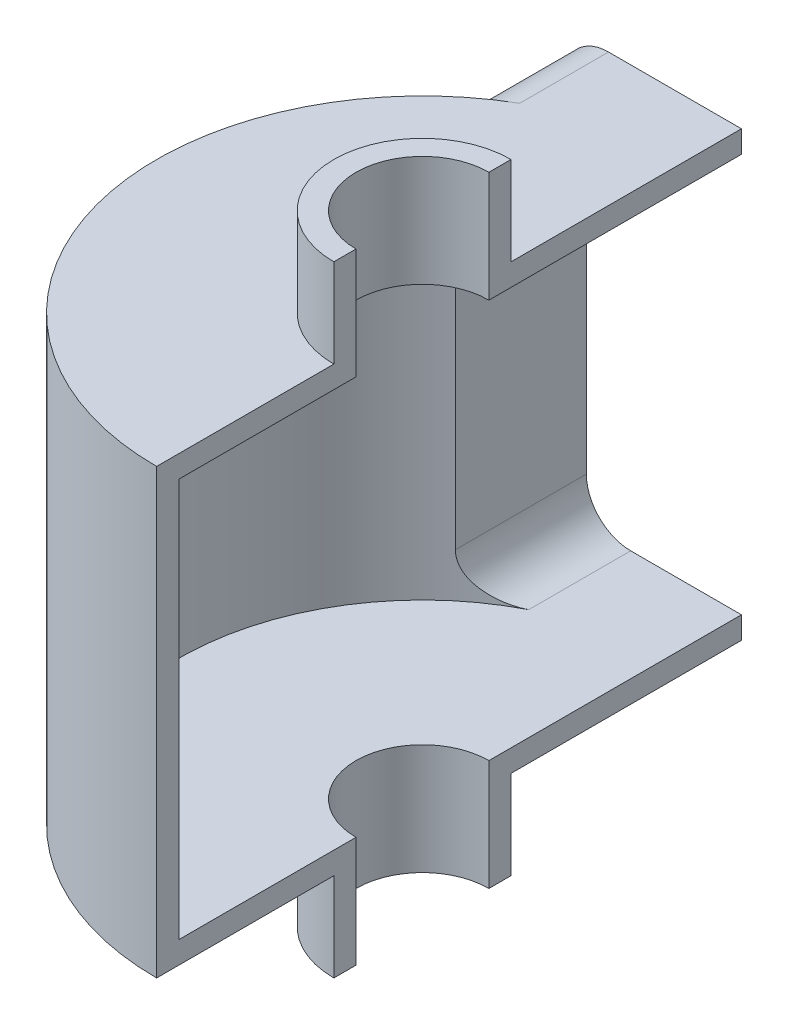
ISO-10303-21;
HEADER;
FILE_DESCRIPTION(('STEP AP214'),'2;1');
FILE_NAME('part.step','',(''),(''),'','','');
FILE_SCHEMA(('AUTOMOTIVE_DESIGN { 1 0 10303 214 1 1 1 1 }'));
ENDSEC;
DATA;
#1=APPLICATION_CONTEXT('core data for automotive mechanical design processes');
#2=APPLICATION_PROTOCOL_DEFINITION('international standard','automotive_design',2000,#1);
#3=PRODUCT_CONTEXT('',#1,'mechanical');
#4=PRODUCT('Part','Part','',(#3));
#5=PRODUCT_RELATED_PRODUCT_CATEGORY('part','',(#4));
#6=PRODUCT_DEFINITION_FORMATION('','',#4);
#7=PRODUCT_DEFINITION_CONTEXT('part definition',#1,'design');
#8=PRODUCT_DEFINITION('design','',#6,#7);
#9=PRODUCT_DEFINITION_SHAPE('','',#8);
#10=(LENGTH_UNIT() NAMED_UNIT(*) SI_UNIT(.MILLI.,.METRE.));
#11=(NAMED_UNIT(*) PLANE_ANGLE_UNIT() SI_UNIT($,.RADIAN.));
#12=(NAMED_UNIT(*) SI_UNIT($,.STERADIAN.) SOLID_ANGLE_UNIT());
#13=UNCERTAINTY_MEASURE_WITH_UNIT(LENGTH_MEASURE(1.E-05),#10,'distance_accuracy_value','');
#14=(GEOMETRIC_REPRESENTATION_CONTEXT(3) GLOBAL_UNCERTAINTY_ASSIGNED_CONTEXT((#13)) GLOBAL_UNIT_ASSIGNED_CONTEXT((#10,
#11,#12)) REPRESENTATION_CONTEXT('',''));
#15=CARTESIAN_POINT('',(0.,0.,0.));
#16=DIRECTION('',(0.,0.,1.));
#17=DIRECTION('',(1.,0.,0.));
#18=AXIS2_PLACEMENT_3D('',#15,#16,#17);
#19=CARTESIAN_POINT('',(0.,25.,0.));
#20=DIRECTION('',(0.,-1.,0.));
#21=DIRECTION('',(0.,0.,-1.));
#22=AXIS2_PLACEMENT_3D('',#19,#20,#21);
#23=CYLINDRICAL_SURFACE('',#22,15.);
#24=CARTESIAN_POINT('',(0.,0.,0.));
#25=DIRECTION('',(0.,-1.,0.));
#26=DIRECTION('',(0.,0.,-1.));
#27=AXIS2_PLACEMENT_3D('',#24,#25,#26);
#28=CIRCLE('',#27,15.);
#29=CARTESIAN_POINT('',(0.,0.,15.));
#30=VERTEX_POINT('',#29);
#31=CARTESIAN_POINT('',(0.,0.,-15.));
#32=VERTEX_POINT('',#31);
#33=EDGE_CURVE('E275',#30,#32,#28,.T.);
#34=ORIENTED_EDGE('',*,*,#33,.T.);
#35=DIRECTION('',(0.,-1.,0.));
#36=VECTOR('',#35,1.);
#37=CARTESIAN_POINT('',(0.,25.,-15.));
#38=LINE('',#37,#36);
#39=CARTESIAN_POINT('',(0.,25.,-15.));
#40=VERTEX_POINT('',#39);
#41=EDGE_CURVE('E299',#40,#32,#38,.T.);
#42=ORIENTED_EDGE('',*,*,#41,.F.);
#43=CARTESIAN_POINT('',(0.,25.,0.));
#44=DIRECTION('',(0.,-1.,0.));
#45=DIRECTION('',(0.,0.,-1.));
#46=AXIS2_PLACEMENT_3D('',#43,#44,#45);
#47=CIRCLE('',#46,15.);
#48=CARTESIAN_POINT('',(0.,25.,15.));
#49=VERTEX_POINT('',#48);
#50=EDGE_CURVE('E276',#49,#40,#47,.T.);
#51=ORIENTED_EDGE('',*,*,#50,.F.);
#52=DIRECTION('',(0.,-1.,0.));
#53=VECTOR('',#52,1.);
#54=CARTESIAN_POINT('',(0.,25.,15.));
#55=LINE('',#54,#53);
#56=EDGE_CURVE('E286',#49,#30,#55,.T.);
#57=ORIENTED_EDGE('',*,*,#56,.T.);
#58=EDGE_LOOP('',(#34,#42,#51,#57));
#59=FACE_BOUND('',#58,.T.);
#60=ADVANCED_FACE('F37',(#59),#23,.F.);
#61=CARTESIAN_POINT('',(0.,25.,-20.));
#62=DIRECTION('',(-1.,0.,0.));
#63=DIRECTION('',(0.,0.,1.));
#64=AXIS2_PLACEMENT_3D('',#61,#62,#63);
#65=PLANE('',#64);
#66=DIRECTION('',(0.,0.,-1.));
#67=VECTOR('',#66,1.);
#68=CARTESIAN_POINT('',(0.,0.,-20.));
#69=LINE('',#68,#67);
#70=CARTESIAN_POINT('',(0.,0.,-72.));
#71=VERTEX_POINT('',#70);
#72=EDGE_CURVE('E289',#32,#71,#69,.T.);
#73=ORIENTED_EDGE('',*,*,#72,.T.);
#74=DIRECTION('',(0.,-1.,0.));
#75=VECTOR('',#74,1.);
#76=CARTESIAN_POINT('',(0.,4.99999999999999,-72.));
#77=LINE('',#76,#75);
#78=CARTESIAN_POINT('',(0.,4.99999999999999,-72.));
#79=VERTEX_POINT('',#78);
#80=EDGE_CURVE('E272',#79,#71,#77,.T.);
#81=ORIENTED_EDGE('',*,*,#80,.F.);
#82=DIRECTION('',(0.,0.,-1.));
#83=VECTOR('',#82,1.);
#84=CARTESIAN_POINT('',(0.,4.99999999999999,-20.));
#85=LINE('',#84,#83);
#86=CARTESIAN_POINT('',(0.,5.,-20.));
#87=VERTEX_POINT('',#86);
#88=EDGE_CURVE('E252',#87,#79,#85,.T.);
#89=ORIENTED_EDGE('',*,*,#88,.F.);
#90=DIRECTION('',(0.,-1.,0.));
#91=VECTOR('',#90,1.);
#92=CARTESIAN_POINT('',(0.,25.,-20.));
#93=LINE('',#92,#91);
#94=CARTESIAN_POINT('',(0.,25.,-20.));
#95=VERTEX_POINT('',#94);
#96=EDGE_CURVE('E297',#95,#87,#93,.T.);
#97=ORIENTED_EDGE('',*,*,#96,.F.);
#98=DIRECTION('',(0.,0.,-1.));
#99=VECTOR('',#98,1.);
#100=CARTESIAN_POINT('',(0.,25.,-20.));
#101=LINE('',#100,#99);
#102=EDGE_CURVE('E279',#40,#95,#101,.T.);
#103=ORIENTED_EDGE('',*,*,#102,.F.);
#104=ORIENTED_EDGE('',*,*,#41,.T.);
#105=EDGE_LOOP('',(#73,#81,#89,#97,#103,#104));
#106=FACE_BOUND('',#105,.T.);
#107=ADVANCED_FACE('F381',(#106),#65,.F.);
#108=CARTESIAN_POINT('',(0.,25.,0.));
#109=DIRECTION('',(0.,-1.,0.));
#110=DIRECTION('',(0.,0.,-1.));
#111=AXIS2_PLACEMENT_3D('',#108,#109,#110);
#112=CYLINDRICAL_SURFACE('',#111,20.);
#113=ORIENTED_EDGE('',*,*,#96,.T.);
#114=CARTESIAN_POINT('',(0.,4.99999999999999,0.));
#115=DIRECTION('',(0.,-1.,0.));
#116=DIRECTION('',(0.,0.,1.));
#117=AXIS2_PLACEMENT_3D('',#114,#115,#116);
#118=CIRCLE('',#117,20.);
#119=CARTESIAN_POINT('',(0.,5.,20.));
#120=VERTEX_POINT('',#119);
#121=EDGE_CURVE('E249',#120,#87,#118,.T.);
#122=ORIENTED_EDGE('',*,*,#121,.F.);
#123=DIRECTION('',(0.,-1.,0.));
#124=VECTOR('',#123,1.);
#125=CARTESIAN_POINT('',(0.,25.,20.));
#126=LINE('',#125,#124);
#127=CARTESIAN_POINT('',(0.,25.,20.));
#128=VERTEX_POINT('',#127);
#129=EDGE_CURVE('E294',#128,#120,#126,.T.);
#130=ORIENTED_EDGE('',*,*,#129,.F.);
#131=CARTESIAN_POINT('',(0.,25.,0.));
#132=DIRECTION('',(0.,1.,0.));
#133=DIRECTION('',(0.,0.,-1.));
#134=AXIS2_PLACEMENT_3D('',#131,#132,#133);
#135=CIRCLE('',#134,20.);
#136=EDGE_CURVE('E282',#95,#128,#135,.T.);
#137=ORIENTED_EDGE('',*,*,#136,.F.);
#138=EDGE_LOOP('',(#113,#122,#130,#137));
#139=FACE_BOUND('',#138,.T.);
#140=ADVANCED_FACE('F386',(#139),#112,.T.);
#141=CARTESIAN_POINT('',(0.,25.,15.));
#142=DIRECTION('',(-1.,0.,0.));
#143=DIRECTION('',(0.,0.,1.));
#144=AXIS2_PLACEMENT_3D('',#141,#142,#143);
#145=PLANE('',#144);
#146=DIRECTION('',(0.,-1.,0.));
#147=VECTOR('',#146,1.);
#148=CARTESIAN_POINT('',(0.,4.99999999999999,60.));
#149=LINE('',#148,#147);
#150=CARTESIAN_POINT('',(0.,4.99999999999999,60.));
#151=VERTEX_POINT('',#150);
#152=CARTESIAN_POINT('',(0.,-95.,60.));
#153=VERTEX_POINT('',#152);
#154=EDGE_CURVE('E262',#151,#153,#149,.T.);
#155=ORIENTED_EDGE('',*,*,#154,.T.);
#156=DIRECTION('',(0.,0.,-1.));
#157=VECTOR('',#156,1.);
#158=CARTESIAN_POINT('',(0.,-95.,20.));
#159=LINE('',#158,#157);
#160=CARTESIAN_POINT('',(0.,-95.,20.));
#161=VERTEX_POINT('',#160);
#162=EDGE_CURVE('E197',#153,#161,#159,.T.);
#163=ORIENTED_EDGE('',*,*,#162,.T.);
#164=DIRECTION('',(0.,1.,0.));
#165=VECTOR('',#164,1.);
#166=CARTESIAN_POINT('',(0.,-115.,20.));
#167=LINE('',#166,#165);
#168=CARTESIAN_POINT('',(0.,-115.,20.));
#169=VERTEX_POINT('',#168);
#170=EDGE_CURVE('E230',#169,#161,#167,.T.);
#171=ORIENTED_EDGE('',*,*,#170,.F.);
#172=DIRECTION('',(0.,0.,-1.));
#173=VECTOR('',#172,1.);
#174=CARTESIAN_POINT('',(0.,-115.,15.));
#175=LINE('',#174,#173);
#176=CARTESIAN_POINT('',(0.,-115.,15.));
#177=VERTEX_POINT('',#176);
#178=EDGE_CURVE('E220',#169,#177,#175,.T.);
#179=ORIENTED_EDGE('',*,*,#178,.T.);
#180=DIRECTION('',(0.,1.,0.));
#181=VECTOR('',#180,1.);
#182=CARTESIAN_POINT('',(0.,-115.,15.));
#183=LINE('',#182,#181);
#184=CARTESIAN_POINT('',(0.,-90.,15.));
#185=VERTEX_POINT('',#184);
#186=EDGE_CURVE('E222',#177,#185,#183,.T.);
#187=ORIENTED_EDGE('',*,*,#186,.T.);
#188=DIRECTION('',(0.,0.,-1.));
#189=VECTOR('',#188,1.);
#190=CARTESIAN_POINT('',(0.,-90.,15.));
#191=LINE('',#190,#189);
#192=CARTESIAN_POINT('',(0.,-90.,55.));
#193=VERTEX_POINT('',#192);
#194=EDGE_CURVE('E215',#193,#185,#191,.T.);
#195=ORIENTED_EDGE('',*,*,#194,.F.);
#196=DIRECTION('',(0.,1.,0.));
#197=VECTOR('',#196,1.);
#198=CARTESIAN_POINT('',(0.,-115.002,55.));
#199=LINE('',#198,#197);
#200=CARTESIAN_POINT('',(0.,0.,55.));
#201=VERTEX_POINT('',#200);
#202=EDGE_CURVE('E238',#193,#201,#199,.T.);
#203=ORIENTED_EDGE('',*,*,#202,.T.);
#204=DIRECTION('',(0.,0.,-1.));
#205=VECTOR('',#204,1.);
#206=CARTESIAN_POINT('',(0.,0.,15.));
#207=LINE('',#206,#205);
#208=EDGE_CURVE('E280',#201,#30,#207,.T.);
#209=ORIENTED_EDGE('',*,*,#208,.T.);
#210=ORIENTED_EDGE('',*,*,#56,.F.);
#211=DIRECTION('',(0.,0.,-1.));
#212=VECTOR('',#211,1.);
#213=CARTESIAN_POINT('',(0.,25.,15.));
#214=LINE('',#213,#212);
#215=EDGE_CURVE('E284',#128,#49,#214,.T.);
#216=ORIENTED_EDGE('',*,*,#215,.F.);
#217=ORIENTED_EDGE('',*,*,#129,.T.);
#218=DIRECTION('',(0.,0.,-1.));
#219=VECTOR('',#218,1.);
#220=CARTESIAN_POINT('',(0.,4.99999999999999,20.));
#221=LINE('',#220,#219);
#222=EDGE_CURVE('E259',#151,#120,#221,.T.);
#223=ORIENTED_EDGE('',*,*,#222,.F.);
#224=EDGE_LOOP('',(#155,#163,#171,#179,#187,#195,#203,#209,#210,#216,#217,#223));
#225=FACE_BOUND('',#224,.T.);
#226=ADVANCED_FACE('F404',(#225),#145,.F.);
#227=CARTESIAN_POINT('',(0.,25.,0.));
#228=DIRECTION('',(0.,-1.,0.));
#229=DIRECTION('',(0.,0.,-1.));
#230=AXIS2_PLACEMENT_3D('',#227,#228,#229);
#231=PLANE('',#230);
#232=ORIENTED_EDGE('',*,*,#50,.T.);
#233=ORIENTED_EDGE('',*,*,#102,.T.);
#234=ORIENTED_EDGE('',*,*,#136,.T.);
#235=ORIENTED_EDGE('',*,*,#215,.T.);
#236=EDGE_LOOP('',(#232,#233,#234,#235));
#237=FACE_BOUND('',#236,.T.);
#238=ADVANCED_FACE('F400',(#237),#231,.F.);
#239=CARTESIAN_POINT('',(0.,0.,0.));
#240=DIRECTION('',(0.,-1.,0.));
#241=DIRECTION('',(0.,0.,-1.));
#242=AXIS2_PLACEMENT_3D('',#239,#240,#241);
#243=PLANE('',#242);
#244=CARTESIAN_POINT('',(0.,0.,0.));
#245=DIRECTION('',(0.,1.,0.));
#246=DIRECTION('',(1.,0.,0.));
#247=AXIS2_PLACEMENT_3D('',#244,#245,#246);
#248=CIRCLE('',#247,55.);
#249=CARTESIAN_POINT('',(-25.,0.,-48.9897948556636));
#250=VERTEX_POINT('',#249);
#251=EDGE_CURVE('E239',#250,#201,#248,.T.);
#252=ORIENTED_EDGE('',*,*,#251,.F.);
#253=DIRECTION('',(0.,0.,1.));
#254=VECTOR('',#253,1.);
#255=CARTESIAN_POINT('',(-25.,0.,0.));
#256=LINE('',#255,#254);
#257=CARTESIAN_POINT('',(-25.,0.,-72.));
#258=VERTEX_POINT('',#257);
#259=EDGE_CURVE('E349',#250,#258,#256,.F.);
#260=ORIENTED_EDGE('',*,*,#259,.T.);
#261=DIRECTION('',(-1.,0.,0.));
#262=VECTOR('',#261,1.);
#263=CARTESIAN_POINT('',(0.,0.,-72.));
#264=LINE('',#263,#262);
#265=EDGE_CURVE('E242',#71,#258,#264,.T.);
#266=ORIENTED_EDGE('',*,*,#265,.F.);
#267=ORIENTED_EDGE('',*,*,#72,.F.);
#268=ORIENTED_EDGE('',*,*,#33,.F.);
#269=ORIENTED_EDGE('',*,*,#208,.F.);
#270=EDGE_LOOP('',(#252,#260,#266,#267,#268,#269));
#271=FACE_BOUND('',#270,.T.);
#272=ADVANCED_FACE('F393',(#271),#243,.T.);
#273=CARTESIAN_POINT('',(0.,4.99999999999999,-72.));
#274=DIRECTION('',(0.,0.,1.));
#275=DIRECTION('',(1.,0.,0.));
#276=AXIS2_PLACEMENT_3D('',#273,#274,#275);
#277=PLANE('',#276);
#278=DIRECTION('',(-1.,0.,0.));
#279=VECTOR('',#278,1.);
#280=CARTESIAN_POINT('',(0.,-95.,-72.));
#281=LINE('',#280,#279);
#282=CARTESIAN_POINT('',(0.,-95.,-72.));
#283=VERTEX_POINT('',#282);
#284=CARTESIAN_POINT('',(-30.,-95.,-72.));
#285=VERTEX_POINT('',#284);
#286=EDGE_CURVE('E178',#283,#285,#281,.T.);
#287=ORIENTED_EDGE('',*,*,#286,.T.);
#288=CARTESIAN_POINT('',(-30.,-85.,-72.));
#289=DIRECTION('',(0.,0.,1.));
#290=DIRECTION('',(1.,0.,0.));
#291=AXIS2_PLACEMENT_3D('',#288,#289,#290);
#292=CIRCLE('',#291,10.);
#293=CARTESIAN_POINT('',(-40.,-85.,-72.));
#294=VERTEX_POINT('',#293);
#295=EDGE_CURVE('E346',#285,#294,#292,.F.);
#296=ORIENTED_EDGE('',*,*,#295,.T.);
#297=DIRECTION('',(0.,-1.,0.));
#298=VECTOR('',#297,1.);
#299=CARTESIAN_POINT('',(-40.,4.99999999999999,-72.));
#300=LINE('',#299,#298);
#301=CARTESIAN_POINT('',(-40.,-5.00000000000001,-72.));
#302=VERTEX_POINT('',#301);
#303=EDGE_CURVE('E269',#302,#294,#300,.T.);
#304=ORIENTED_EDGE('',*,*,#303,.F.);
#305=CARTESIAN_POINT('',(-30.,-5.00000000000001,-72.));
#306=DIRECTION('',(0.,0.,1.));
#307=DIRECTION('',(1.,0.,0.));
#308=AXIS2_PLACEMENT_3D('',#305,#306,#307);
#309=CIRCLE('',#308,10.);
#310=CARTESIAN_POINT('',(-30.,4.99999999999999,-72.));
#311=VERTEX_POINT('',#310);
#312=EDGE_CURVE('E307',#302,#311,#309,.F.);
#313=ORIENTED_EDGE('',*,*,#312,.T.);
#314=DIRECTION('',(-1.,0.,0.));
#315=VECTOR('',#314,1.);
#316=CARTESIAN_POINT('',(0.,4.99999999999999,-72.));
#317=LINE('',#316,#315);
#318=EDGE_CURVE('E254',#79,#311,#317,.T.);
#319=ORIENTED_EDGE('',*,*,#318,.F.);
#320=ORIENTED_EDGE('',*,*,#80,.T.);
#321=ORIENTED_EDGE('',*,*,#265,.T.);
#322=CARTESIAN_POINT('',(-25.,-9.99999999999999,-72.));
#323=DIRECTION('',(0.,0.,1.));
#324=DIRECTION('',(1.,0.,0.));
#325=AXIS2_PLACEMENT_3D('',#322,#323,#324);
#326=CIRCLE('',#325,10.);
#327=CARTESIAN_POINT('',(-35.,-9.99999999999999,-72.));
#328=VERTEX_POINT('',#327);
#329=EDGE_CURVE('E358',#258,#328,#326,.T.);
#330=ORIENTED_EDGE('',*,*,#329,.T.);
#331=DIRECTION('',(0.,1.,0.));
#332=VECTOR('',#331,1.);
#333=CARTESIAN_POINT('',(-35.,-115.002,-72.));
#334=LINE('',#333,#332);
#335=CARTESIAN_POINT('',(-35.,-80.,-72.));
#336=VERTEX_POINT('',#335);
#337=EDGE_CURVE('E243',#336,#328,#334,.T.);
#338=ORIENTED_EDGE('',*,*,#337,.F.);
#339=CARTESIAN_POINT('',(-25.,-80.,-72.));
#340=DIRECTION('',(0.,0.,1.));
#341=DIRECTION('',(1.,0.,0.));
#342=AXIS2_PLACEMENT_3D('',#339,#340,#341);
#343=CIRCLE('',#342,10.);
#344=CARTESIAN_POINT('',(-25.,-90.,-72.));
#345=VERTEX_POINT('',#344);
#346=EDGE_CURVE('E51',#336,#345,#343,.T.);
#347=ORIENTED_EDGE('',*,*,#346,.T.);
#348=DIRECTION('',(-1.,0.,0.));
#349=VECTOR('',#348,1.);
#350=CARTESIAN_POINT('',(0.,-90.,-72.));
#351=LINE('',#350,#349);
#352=CARTESIAN_POINT('',(0.,-90.,-72.));
#353=VERTEX_POINT('',#352);
#354=EDGE_CURVE('E193',#353,#345,#351,.T.);
#355=ORIENTED_EDGE('',*,*,#354,.F.);
#356=DIRECTION('',(0.,1.,0.));
#357=VECTOR('',#356,1.);
#358=CARTESIAN_POINT('',(0.,-95.,-72.));
#359=LINE('',#358,#357);
#360=EDGE_CURVE('E191',#283,#353,#359,.T.);
#361=ORIENTED_EDGE('',*,*,#360,.F.);
#362=EDGE_LOOP('',(#287,#296,#304,#313,#319,#320,#321,#330,#338,#347,#355,#361));
#363=FACE_BOUND('',#362,.T.);
#364=ADVANCED_FACE('F192',(#363),#277,.F.);
#365=CARTESIAN_POINT('',(-40.,4.99999999999999,-72.));
#366=DIRECTION('',(1.,0.,0.));
#367=DIRECTION('',(0.,0.,-1.));
#368=AXIS2_PLACEMENT_3D('',#365,#366,#367);
#369=PLANE('',#368);
#370=ORIENTED_EDGE('',*,*,#303,.T.);
#371=DIRECTION('',(0.,0.,1.));
#372=VECTOR('',#371,1.);
#373=CARTESIAN_POINT('',(-40.,-85.,-44.7213595499958));
#374=LINE('',#373,#372);
#375=CARTESIAN_POINT('',(-40.,-85.,-44.7213595499958));
#376=VERTEX_POINT('',#375);
#377=EDGE_CURVE('E317',#294,#376,#374,.T.);
#378=ORIENTED_EDGE('',*,*,#377,.T.);
#379=DIRECTION('',(0.,-1.,0.));
#380=VECTOR('',#379,1.);
#381=CARTESIAN_POINT('',(-40.,4.99999999999999,-44.7213595499958));
#382=LINE('',#381,#380);
#383=CARTESIAN_POINT('',(-40.,-5.00000000000001,-44.7213595499958));
#384=VERTEX_POINT('',#383);
#385=EDGE_CURVE('E266',#384,#376,#382,.T.);
#386=ORIENTED_EDGE('',*,*,#385,.F.);
#387=DIRECTION('',(0.,0.,1.));
#388=VECTOR('',#387,1.);
#389=CARTESIAN_POINT('',(-40.,-5.00000000000001,-72.));
#390=LINE('',#389,#388);
#391=EDGE_CURVE('E305',#384,#302,#390,.F.);
#392=ORIENTED_EDGE('',*,*,#391,.T.);
#393=EDGE_LOOP('',(#370,#378,#386,#392));
#394=FACE_BOUND('',#393,.T.);
#395=ADVANCED_FACE('F378',(#394),#369,.F.);
#396=CARTESIAN_POINT('',(0.,4.99999999999999,0.));
#397=DIRECTION('',(0.,-1.,0.));
#398=DIRECTION('',(0.,0.,-1.));
#399=AXIS2_PLACEMENT_3D('',#396,#397,#398);
#400=CYLINDRICAL_SURFACE('',#399,60.);
#401=CARTESIAN_POINT('',(0.,4.99999999999999,0.));
#402=DIRECTION('',(0.,1.,0.));
#403=DIRECTION('',(0.,0.,-1.));
#404=AXIS2_PLACEMENT_3D('',#401,#402,#403);
#405=CIRCLE('',#404,60.);
#406=CARTESIAN_POINT('',(-30.,4.99999999999999,-51.9615242270663));
#407=VERTEX_POINT('',#406);
#408=EDGE_CURVE('E257',#407,#151,#405,.T.);
#409=ORIENTED_EDGE('',*,*,#408,.F.);
#410=CARTESIAN_POINT('',(-30.,4.99999999999999,-51.9615242270663));
#411=CARTESIAN_POINT('',(-30.1846403402756,4.99999694467444,-51.8549243575684));
#412=CARTESIAN_POINT('',(-30.3686755821332,4.99488587812622,-51.7473565843307));
#413=CARTESIAN_POINT('',(-30.7351668388072,4.97462918627215,-51.5305231450817));
#414=CARTESIAN_POINT('',(-30.9176229894396,4.95948443281986,-51.4212576273974));
#415=CARTESIAN_POINT('',(-31.4619253243051,4.89929167200635,-51.0913595980358));
#416=CARTESIAN_POINT('',(-31.8209014856786,4.83948477245504,-50.868512343648));
#417=CARTESIAN_POINT('',(-32.5288887310146,4.68176841927459,-50.418725257113));
#418=CARTESIAN_POINT('',(-32.8778736192083,4.58376717889359,-50.1917768316845));
#419=CARTESIAN_POINT('',(-33.562476910193,4.35090696893925,-49.7365966241752));
#420=CARTESIAN_POINT('',(-33.8980954977704,4.21604850911224,-49.5083648598862));
#421=CARTESIAN_POINT('',(-34.5207296024579,3.92574534472067,-49.0759439346811));
#422=CARTESIAN_POINT('',(-34.8092512536601,3.77370267176126,-48.8716304811259));
#423=CARTESIAN_POINT('',(-35.3716903107987,3.44107089228342,-48.4661085573826));
#424=CARTESIAN_POINT('',(-35.6456079007732,3.26048214561175,-48.2649000480893));
#425=CARTESIAN_POINT('',(-36.1765727574088,2.87135112309204,-47.8682074936152));
#426=CARTESIAN_POINT('',(-36.4336405194033,2.66284378257166,-47.6727166603459));
#427=CARTESIAN_POINT('',(-36.9290721152615,2.21794621899144,-47.289972828363));
#428=CARTESIAN_POINT('',(-37.167441451851,1.98156425075618,-47.1027174132443));
#429=CARTESIAN_POINT('',(-37.565018182153,1.54478146403291,-46.785859634165));
#430=CARTESIAN_POINT('',(-37.7289458526818,1.35050833176436,-46.6537017113221));
#431=CARTESIAN_POINT('',(-38.043765038696,0.94671050583668,-46.397339573439));
#432=CARTESIAN_POINT('',(-38.1946575996422,0.73718703779544,-46.2731347207424));
#433=CARTESIAN_POINT('',(-38.4818360085844,0.303399948510732,-46.0345861261904));
#434=CARTESIAN_POINT('',(-38.618136880254,0.0791518792914291,-45.9202322658759));
#435=CARTESIAN_POINT('',(-38.8746918035924,-0.383743447816972,-45.7032445431668));
#436=CARTESIAN_POINT('',(-38.9949492411763,-0.622387651960068,-45.6006082084878));
#437=CARTESIAN_POINT('',(-39.1965662504922,-1.06669402634215,-45.4273417305266));
#438=CARTESIAN_POINT('',(-39.2809795718103,-1.27004581930022,-45.3543309967536));
#439=CARTESIAN_POINT('',(-39.437114382813,-1.68488791321455,-45.2186323209963));
#440=CARTESIAN_POINT('',(-39.508838494378,-1.89637652189832,-45.1559422467147));
#441=CARTESIAN_POINT('',(-39.6385128100447,-2.32617263610177,-45.0421551914612));
#442=CARTESIAN_POINT('',(-39.6964869139818,-2.54446755239788,-44.9910381018204));
#443=CARTESIAN_POINT('',(-39.7978943535571,-2.986852666006,-44.9013606141582));
#444=CARTESIAN_POINT('',(-39.8413328734582,-3.2109407663361,-44.8627957393971));
#445=CARTESIAN_POINT('',(-39.9177189665931,-3.69377442824111,-44.7948514731765));
#446=CARTESIAN_POINT('',(-39.9484884415043,-3.95314914513775,-44.7673886419263));
#447=CARTESIAN_POINT('',(-39.9793476433001,-4.34440444684136,-44.7398248250479));
#448=CARTESIAN_POINT('',(-39.987084921451,-4.47527578752074,-44.7329085695169));
#449=CARTESIAN_POINT('',(-39.9974129661721,-4.73742237599205,-44.7236736235071));
#450=CARTESIAN_POINT('',(-40.0000021863485,-4.86869773328783,-44.7213563144782));
#451=CARTESIAN_POINT('',(-40.,-5.00000000000001,-44.7213595499958));
#452=B_SPLINE_CURVE_WITH_KNOTS('',3,(#410,#411,#412,#413,#414,#415,#416,#417,#418,#419,#420,
#421,#422,#423,#424,#425,#426,#427,#428,#429,#430,#431,#432,#433,#434,#435,#436,#437,#438,#439,
#440,#441,#442,#443,#444,#445,#446,#447,#448,#449,#450,#451),.UNSPECIFIED.,.F.,.F.,(4,2,2,2,2,2,
2,2,2,2,2,2,2,2,2,2,2,2,2,2,4),(0.,0.639469988122805,1.27888441829631,2.55703672344089,
3.83827975129429,5.11950506007104,6.27274736359203,7.42597513070352,8.57777308710979,
9.72923080131074,10.5879927572485,11.4466857734357,12.3044859953459,13.1621048939207,
13.8573439066469,14.5524390989254,15.2463170957639,15.9399473495784,16.7262834977137,
17.1199731890566,17.5137811205932),.UNSPECIFIED.);
#453=EDGE_CURVE('E309',#407,#384,#452,.T.);
#454=ORIENTED_EDGE('',*,*,#453,.T.);
#455=ORIENTED_EDGE('',*,*,#385,.T.);
#456=CARTESIAN_POINT('',(-40.,-85.,-44.7213595499958));
#457=CARTESIAN_POINT('',(-40.0000015812733,-85.117663401002,-44.7213573011344));
#458=CARTESIAN_POINT('',(-39.9979227141808,-85.2353086549856,-44.7232176305845));
#459=CARTESIAN_POINT('',(-39.9896253110866,-85.4703286016598,-44.7306372942271));
#460=CARTESIAN_POINT('',(-39.9834070494192,-85.5877033117632,-44.7361963832882));
#461=CARTESIAN_POINT('',(-39.9585923280535,-85.9388427467586,-44.7583670958171));
#462=CARTESIAN_POINT('',(-39.9338358355778,-86.1718758054602,-44.7804722797486));
#463=CARTESIAN_POINT('',(-39.8686644525486,-86.6318691326489,-44.8385042167554));
#464=CARTESIAN_POINT('',(-39.8283855148164,-86.8588643223736,-44.8743109465834));
#465=CARTESIAN_POINT('',(-39.7328892662281,-87.3072524479117,-44.9588875680342));
#466=CARTESIAN_POINT('',(-39.6776696039361,-87.5286444958755,-45.0076595001554));
#467=CARTESIAN_POINT('',(-39.5534118644793,-87.9636688649734,-45.116897250534));
#468=CARTESIAN_POINT('',(-39.4844211995899,-88.1773249178853,-45.1773229225701));
#469=CARTESIAN_POINT('',(-39.3334605195833,-88.5966936542645,-45.3088170177995));
#470=CARTESIAN_POINT('',(-39.2514857085459,-88.8024033675523,-45.3798893730022));
#471=CARTESIAN_POINT('',(-39.0753863002099,-89.2054529377369,-45.5316122169457));
#472=CARTESIAN_POINT('',(-38.9812363061758,-89.4027741200323,-45.6122826978885));
#473=CARTESIAN_POINT('',(-38.7818943790383,-89.7880467498959,-45.7818938454653));
#474=CARTESIAN_POINT('',(-38.6767013504078,-89.9759972651115,-45.8708353325264));
#475=CARTESIAN_POINT('',(-38.4135728743112,-90.4129070483267,-46.0916172160901));
#476=CARTESIAN_POINT('',(-38.2509572804995,-90.6573967975821,-46.2267600621542));
#477=CARTESIAN_POINT('',(-37.908447036405,-91.1270697633622,-46.5080507377658));
#478=CARTESIAN_POINT('',(-37.7285517130429,-91.3522522271834,-46.6541989959475));
#479=CARTESIAN_POINT('',(-37.3531054007839,-91.7833337426989,-46.9553345195759));
#480=CARTESIAN_POINT('',(-37.1575367002328,-91.9892103913972,-47.1103317262239));
#481=CARTESIAN_POINT('',(-36.7525951751676,-92.3811838692743,-47.4269223387039));
#482=CARTESIAN_POINT('',(-36.5432234671629,-92.5672822951176,-47.5885152106185));
#483=CARTESIAN_POINT('',(-35.889352420626,-93.1015951815724,-48.0859277319981));
#484=CARTESIAN_POINT('',(-35.4251261289153,-93.4189829871174,-48.429498559668));
#485=CARTESIAN_POINT('',(-34.4553726874119,-93.9699716496597,-49.1241578823887));
#486=CARTESIAN_POINT('',(-33.9498747171002,-94.2036310842669,-49.4752409388269));
#487=CARTESIAN_POINT('',(-33.1568278633415,-94.4930456878643,-50.0073212539565));
#488=CARTESIAN_POINT('',(-32.8810021018505,-94.5803819665683,-50.1891501210001));
#489=CARTESIAN_POINT('',(-32.3217375725054,-94.7310524671282,-50.5511235483305));
#490=CARTESIAN_POINT('',(-32.0382991780871,-94.7943878640466,-50.7312681906542));
#491=CARTESIAN_POINT('',(-31.4650006560554,-94.8963939978526,-51.0888227050653));
#492=CARTESIAN_POINT('',(-31.1751356203563,-94.935045161166,-51.2662302982853));
#493=CARTESIAN_POINT('',(-30.5906934832528,-94.9868485137105,-51.6171131325133));
#494=CARTESIAN_POINT('',(-30.2961152167169,-94.9999942965489,-51.7905873747387));
#495=CARTESIAN_POINT('',(-30.,-95.,-51.9615242270663));
#496=B_SPLINE_CURVE_WITH_KNOTS('',3,(#456,#457,#458,#459,#460,#461,#462,#463,#464,#465,#466,
#467,#468,#469,#470,#471,#472,#473,#474,#475,#476,#477,#478,#479,#480,#481,#482,#483,#484,#485,
#486,#487,#488,#489,#490,#491,#492,#493,#494,#495),.UNSPECIFIED.,.F.,.F.,(4,2,2,2,2,2,2,2,2,2,2,
2,2,2,2,2,2,2,2,4),(0.,0.352921378883185,0.705819370583172,1.41085932128631,2.10985961734753,
2.80896998914977,3.50571366437717,4.2027152967345,4.90119502233958,5.59974410640154,
6.5680578816333,7.536409389878,8.50587104319846,9.47525437387455,11.4447404103531,
13.4128458625583,14.4372042618812,15.4615125030147,16.4866319729198,17.5120088970542),.UNSPECIFIED.);
#497=CARTESIAN_POINT('',(-30.,-95.,-51.9615242270663));
#498=VERTEX_POINT('',#497);
#499=EDGE_CURVE('E337',#376,#498,#496,.T.);
#500=ORIENTED_EDGE('',*,*,#499,.T.);
#501=CARTESIAN_POINT('',(0.,-95.,0.));
#502=DIRECTION('',(0.,1.,0.));
#503=DIRECTION('',(0.,0.,-1.));
#504=AXIS2_PLACEMENT_3D('',#501,#502,#503);
#505=CIRCLE('',#504,60.);
#506=EDGE_CURVE('E188',#498,#153,#505,.T.);
#507=ORIENTED_EDGE('',*,*,#506,.T.);
#508=ORIENTED_EDGE('',*,*,#154,.F.);
#509=EDGE_LOOP('',(#409,#454,#455,#500,#507,#508));
#510=FACE_BOUND('',#509,.T.);
#511=ADVANCED_FACE('F319',(#510),#400,.T.);
#512=CARTESIAN_POINT('',(0.,4.99999999999999,0.));
#513=DIRECTION('',(0.,1.,0.));
#514=DIRECTION('',(0.,0.,1.));
#515=AXIS2_PLACEMENT_3D('',#512,#513,#514);
#516=PLANE('',#515);
#517=ORIENTED_EDGE('',*,*,#318,.T.);
#518=DIRECTION('',(0.,0.,1.));
#519=VECTOR('',#518,1.);
#520=CARTESIAN_POINT('',(-30.,4.99999999999999,-44.7213595499958));
#521=LINE('',#520,#519);
#522=EDGE_CURVE('E302',#311,#407,#521,.T.);
#523=ORIENTED_EDGE('',*,*,#522,.T.);
#524=ORIENTED_EDGE('',*,*,#408,.T.);
#525=ORIENTED_EDGE('',*,*,#222,.T.);
#526=ORIENTED_EDGE('',*,*,#121,.T.);
#527=ORIENTED_EDGE('',*,*,#88,.T.);
#528=EDGE_LOOP('',(#517,#523,#524,#525,#526,#527));
#529=FACE_BOUND('',#528,.T.);
#530=ADVANCED_FACE('F366',(#529),#516,.T.);
#531=CARTESIAN_POINT('',(0.,-115.002,0.));
#532=DIRECTION('',(0.,1.,0.));
#533=DIRECTION('',(0.,0.,1.));
#534=AXIS2_PLACEMENT_3D('',#531,#532,#533);
#535=CYLINDRICAL_SURFACE('',#534,55.);
#536=ORIENTED_EDGE('',*,*,#202,.F.);
#537=CARTESIAN_POINT('',(0.,-90.,0.));
#538=DIRECTION('',(0.,1.,0.));
#539=DIRECTION('',(0.,0.,1.));
#540=AXIS2_PLACEMENT_3D('',#537,#538,#539);
#541=CIRCLE('',#540,55.);
#542=CARTESIAN_POINT('',(-25.,-90.,-48.9897948556636));
#543=VERTEX_POINT('',#542);
#544=EDGE_CURVE('E57',#193,#543,#541,.F.);
#545=ORIENTED_EDGE('',*,*,#544,.T.);
#546=CARTESIAN_POINT('',(-25.,-90.,-48.9897948556636));
#547=CARTESIAN_POINT('',(-25.1906704625853,-89.9999971656189,-48.8924964907343));
#548=CARTESIAN_POINT('',(-25.3807299051036,-89.994546206801,-48.7941008127997));
#549=CARTESIAN_POINT('',(-25.7591946792121,-89.9729416657178,-48.5953653194177));
#550=CARTESIAN_POINT('',(-25.947600172291,-89.9567891403815,-48.4950256969118));
#551=CARTESIAN_POINT('',(-26.5095199627771,-89.8925935595296,-48.1915584402701));
#552=CARTESIAN_POINT('',(-26.879966617226,-89.8288120264318,-47.985865462464));
#553=CARTESIAN_POINT('',(-27.6092367230561,-89.6608532752705,-47.5700172433392));
#554=CARTESIAN_POINT('',(-27.9680515865195,-89.5566469152987,-47.3598588865119));
#555=CARTESIAN_POINT('',(-28.6708870947942,-89.3093143170567,-46.9377053718885));
#556=CARTESIAN_POINT('',(-29.0149087495746,-89.1661907406623,-46.7257103406777));
#557=CARTESIAN_POINT('',(-29.6343122240442,-88.8669502099571,-46.3348745882726));
#558=CARTESIAN_POINT('',(-29.9121762835488,-88.7161192793689,-46.1558947290866));
#559=CARTESIAN_POINT('',(-30.453564058984,-88.3880155176435,-45.8004938086764));
#560=CARTESIAN_POINT('',(-30.7170889667725,-88.210744888747,-45.6240725356815));
#561=CARTESIAN_POINT('',(-31.2277793899634,-87.8304558145634,-45.27605554075));
#562=CARTESIAN_POINT('',(-31.4749603097885,-87.6274621555616,-45.1044553652141));
#563=CARTESIAN_POINT('',(-31.9512644556701,-87.1960491883292,-44.7683103206218));
#564=CARTESIAN_POINT('',(-32.1803914213147,-86.9676351692916,-44.60376399371));
#565=CARTESIAN_POINT('',(-32.5724334975713,-86.536394282226,-44.3179704705643));
#566=CARTESIAN_POINT('',(-32.7391594522469,-86.3382416976567,-44.1948776144083));
#567=CARTESIAN_POINT('',(-33.0586989979014,-85.9266540781595,-43.956366411861));
#568=CARTESIAN_POINT('',(-33.2115135789463,-85.7132201327334,-43.8409475194751));
#569=CARTESIAN_POINT('',(-33.5016809731426,-85.2717299317312,-43.6196131502262));
#570=CARTESIAN_POINT('',(-33.6390478315194,-85.0436872596241,-43.5136890586718));
#571=CARTESIAN_POINT('',(-33.8968966266417,-84.5735187782177,-43.3131282626193));
#572=CARTESIAN_POINT('',(-34.0173818752135,-84.3313957444228,-43.2184893447453));
#573=CARTESIAN_POINT('',(-34.220345560487,-83.8775967975981,-43.0578872759331));
#574=CARTESIAN_POINT('',(-34.3057864350373,-83.6679931294044,-42.9898029979803));
#575=CARTESIAN_POINT('',(-34.4630420236251,-83.2407750890927,-42.8638412603264));
#576=CARTESIAN_POINT('',(-34.534859392632,-83.023162287697,-42.805961812048));
#577=CARTESIAN_POINT('',(-34.6638213670323,-82.5813588577465,-42.7015968076424));
#578=CARTESIAN_POINT('',(-34.7209903361364,-82.357179851681,-42.6550923381947));
#579=CARTESIAN_POINT('',(-34.8199345283325,-81.9033665270967,-42.5743613090907));
#580=CARTESIAN_POINT('',(-34.8617157478199,-81.6737343708085,-42.5401299669028));
#581=CARTESIAN_POINT('',(-34.9300837462733,-81.2045822520297,-42.4840120509156));
#582=CARTESIAN_POINT('',(-34.9562545186649,-80.9649596154708,-42.462463650073));
#583=CARTESIAN_POINT('',(-34.9824752970613,-80.6039690758757,-42.4408592306511));
#584=CARTESIAN_POINT('',(-34.9890430057937,-80.4833431270819,-42.4354441063026));
#585=CARTESIAN_POINT('',(-34.9978062165355,-80.241817657905,-42.4282167617888));
#586=CARTESIAN_POINT('',(-35.0000014553635,-80.120918121493,-42.4264047584974));
#587=CARTESIAN_POINT('',(-35.,-80.,-42.4264068711928));
#588=B_SPLINE_CURVE_WITH_KNOTS('',3,(#546,#547,#548,#549,#550,#551,#552,#553,#554,#555,#556,
#557,#558,#559,#560,#561,#562,#563,#564,#565,#566,#567,#568,#569,#570,#571,#572,#573,#574,#575,
#576,#577,#578,#579,#580,#581,#582,#583,#584,#585,#586,#587),.UNSPECIFIED.,.F.,.F.,(4,2,2,2,2,2,
2,2,2,2,2,2,2,2,2,2,2,2,2,2,4),(0.,0.64202515354695,1.28398690760975,2.56714249695266,
3.85122482619341,5.13521934832298,6.22394893506148,7.31258788888126,8.4001857133023,
9.48755766375219,10.3469757139952,11.2063325519534,12.0649016266236,12.9233020310802,
13.6317123054177,14.3399843815419,15.047070674944,15.7538811342204,16.4787715527391,
16.8414339261367,17.2041181277167),.UNSPECIFIED.);
#589=CARTESIAN_POINT('',(-35.,-80.,-42.4264068711928));
#590=VERTEX_POINT('',#589);
#591=EDGE_CURVE('E11',#543,#590,#588,.T.);
#592=ORIENTED_EDGE('',*,*,#591,.T.);
#593=DIRECTION('',(0.,1.,0.));
#594=VECTOR('',#593,1.);
#595=CARTESIAN_POINT('',(-35.,-115.002,-42.4264068711928));
#596=LINE('',#595,#594);
#597=CARTESIAN_POINT('',(-35.,-9.99999999999999,-42.4264068711928));
#598=VERTEX_POINT('',#597);
#599=EDGE_CURVE('E246',#590,#598,#596,.T.);
#600=ORIENTED_EDGE('',*,*,#599,.T.);
#601=CARTESIAN_POINT('',(-35.,-9.99999999999999,-42.4264068711928));
#602=CARTESIAN_POINT('',(-35.0000014497964,-9.87987310315719,-42.4264047837681));
#603=CARTESIAN_POINT('',(-34.9978348514331,-9.75976422715493,-42.4281931348836));
#604=CARTESIAN_POINT('',(-34.9891857816154,-9.51981491367695,-42.4353263709232));
#605=CARTESIAN_POINT('',(-34.9827035721487,-9.39997446034919,-42.4406710399539));
#606=CARTESIAN_POINT('',(-34.956830452997,-9.04141786262553,-42.4619893413881));
#607=CARTESIAN_POINT('',(-34.9310129679865,-8.80342910014089,-42.4832473662838));
#608=CARTESIAN_POINT('',(-34.8629816882097,-8.33339460407184,-42.5390927002779));
#609=CARTESIAN_POINT('',(-34.820898919531,-8.10131678852098,-42.5735734756723));
#610=CARTESIAN_POINT('',(-34.7210380015034,-7.64278126517026,-42.6550543990627));
#611=CARTESIAN_POINT('',(-34.6632576605496,-7.4163243469495,-42.7020562951679));
#612=CARTESIAN_POINT('',(-34.5330883120894,-6.97116269404727,-42.807391745231));
#613=CARTESIAN_POINT('',(-34.4607440027141,-6.75243659053953,-42.865690607765));
#614=CARTESIAN_POINT('',(-34.3022805482754,-6.32304828482198,-42.9926022625577));
#615=CARTESIAN_POINT('',(-34.2161564051557,-6.11238904301828,-43.061218796573));
#616=CARTESIAN_POINT('',(-34.03096608752,-5.69966121720984,-43.2077227263221));
#617=CARTESIAN_POINT('',(-33.9318751543174,-5.49761007347531,-43.2856278316291));
#618=CARTESIAN_POINT('',(-33.7218564369498,-5.10314735561813,-43.4494435165853));
#619=CARTESIAN_POINT('',(-33.610927467307,-4.91073674975316,-43.535354897885));
#620=CARTESIAN_POINT('',(-33.3379150398717,-4.47123433911838,-43.7449695332966));
#621=CARTESIAN_POINT('',(-33.1713989056376,-4.22821699400697,-43.87147497144));
#622=CARTESIAN_POINT('',(-32.820669795309,-3.76121521493266,-44.1344729444258));
#623=CARTESIAN_POINT('',(-32.6364569574066,-3.53723063237016,-44.2709654012783));
#624=CARTESIAN_POINT('',(-32.2518815980921,-3.10846762196946,-44.5519118289509));
#625=CARTESIAN_POINT('',(-32.0515019123395,-2.90371011997532,-44.6963742086041));
#626=CARTESIAN_POINT('',(-31.6364068995163,-2.5140694607911,-44.9911403692426));
#627=CARTESIAN_POINT('',(-31.4216926181169,-2.3291848564877,-45.1414437238107));
#628=CARTESIAN_POINT('',(-30.7527718961723,-1.80053893105145,-45.6022087667656));
#629=CARTESIAN_POINT('',(-30.2782224789075,-1.4876819776076,-45.9192504365907));
#630=CARTESIAN_POINT('',(-29.2863950159429,-0.947634918697291,-46.5580783691839));
#631=CARTESIAN_POINT('',(-28.7691524751348,-0.720374486477762,-46.8798605102554));
#632=CARTESIAN_POINT('',(-27.9782964577458,-0.449937168922881,-47.3529868290529));
#633=CARTESIAN_POINT('',(-27.71720700781,-0.372373069617562,-47.5063120740257));
#634=CARTESIAN_POINT('',(-27.1884092746343,-0.238585466265289,-47.8109125009315));
#635=CARTESIAN_POINT('',(-26.9207016309538,-0.182359908655269,-47.9621878787861));
#636=CARTESIAN_POINT('',(-26.379727809034,-0.0918406003391309,-48.2618435343977));
#637=CARTESIAN_POINT('',(-26.1064574293253,-0.0575641135549311,-48.4102214444596));
#638=CARTESIAN_POINT('',(-25.5558838504953,-0.0116400796050153,-48.703127245693));
#639=CARTESIAN_POINT('',(-25.2785794886699,8.07737825505599E-07,-48.8476539914468));
#640=CARTESIAN_POINT('',(-25.,0.,-48.9897948556636));
#641=B_SPLINE_CURVE_WITH_KNOTS('',3,(#601,#602,#603,#604,#605,#606,#607,#608,#609,#610,#611,
#612,#613,#614,#615,#616,#617,#618,#619,#620,#621,#622,#623,#624,#625,#626,#627,#628,#629,#630,
#631,#632,#633,#634,#635,#636,#637,#638,#639,#640),.UNSPECIFIED.,.F.,.F.,(4,2,2,2,2,2,2,2,2,2,2,
2,2,2,2,2,2,2,2,4),(0.,0.360312293922661,0.720602716369276,1.44047421081293,2.15466369102643,
2.86895293355911,3.58108249267798,4.29347093489963,5.00724001410331,5.72108063834975,
6.68154144938632,7.6419947608704,8.60348155414833,9.56489828596205,11.509617073525,
13.4527345617431,14.3897475989406,15.326670437678,16.2643293057158,17.2022640090674),.UNSPECIFIED.);
#642=EDGE_CURVE('E351',#598,#250,#641,.T.);
#643=ORIENTED_EDGE('',*,*,#642,.T.);
#644=ORIENTED_EDGE('',*,*,#251,.T.);
#645=EDGE_LOOP('',(#536,#545,#592,#600,#643,#644));
#646=FACE_BOUND('',#645,.T.);
#647=ADVANCED_FACE('F360',(#646),#535,.F.);
#648=CARTESIAN_POINT('',(-35.,-115.002,-72.));
#649=DIRECTION('',(-1.,0.,0.));
#650=DIRECTION('',(0.,0.,1.));
#651=AXIS2_PLACEMENT_3D('',#648,#649,#650);
#652=PLANE('',#651);
#653=ORIENTED_EDGE('',*,*,#599,.F.);
#654=DIRECTION('',(0.,0.,-1.));
#655=VECTOR('',#654,1.);
#656=CARTESIAN_POINT('',(-35.,-80.,-72.));
#657=LINE('',#656,#655);
#658=EDGE_CURVE('E413',#590,#336,#657,.T.);
#659=ORIENTED_EDGE('',*,*,#658,.T.);
#660=ORIENTED_EDGE('',*,*,#337,.T.);
#661=DIRECTION('',(0.,0.,1.));
#662=VECTOR('',#661,1.);
#663=CARTESIAN_POINT('',(-35.,-9.99999999999999,-72.));
#664=LINE('',#663,#662);
#665=EDGE_CURVE('E345',#328,#598,#664,.T.);
#666=ORIENTED_EDGE('',*,*,#665,.T.);
#667=EDGE_LOOP('',(#653,#659,#660,#666));
#668=FACE_BOUND('',#667,.T.);
#669=ADVANCED_FACE('F365',(#668),#652,.F.);
#670=CARTESIAN_POINT('',(0.,-90.,0.));
#671=DIRECTION('',(0.,1.,0.));
#672=DIRECTION('',(0.,0.,-1.));
#673=AXIS2_PLACEMENT_3D('',#670,#671,#672);
#674=PLANE('',#673);
#675=ORIENTED_EDGE('',*,*,#354,.T.);
#676=DIRECTION('',(0.,0.,-1.));
#677=VECTOR('',#676,1.);
#678=CARTESIAN_POINT('',(-25.,-90.,0.));
#679=LINE('',#678,#677);
#680=EDGE_CURVE('E415',#345,#543,#679,.F.);
#681=ORIENTED_EDGE('',*,*,#680,.T.);
#682=ORIENTED_EDGE('',*,*,#544,.F.);
#683=ORIENTED_EDGE('',*,*,#194,.T.);
#684=CARTESIAN_POINT('',(0.,-90.,0.));
#685=DIRECTION('',(0.,-1.,0.));
#686=DIRECTION('',(0.,0.,-1.));
#687=AXIS2_PLACEMENT_3D('',#684,#685,#686);
#688=CIRCLE('',#687,15.);
#689=CARTESIAN_POINT('',(0.,-90.,-15.));
#690=VERTEX_POINT('',#689);
#691=EDGE_CURVE('E196',#185,#690,#688,.T.);
#692=ORIENTED_EDGE('',*,*,#691,.T.);
#693=DIRECTION('',(0.,0.,-1.));
#694=VECTOR('',#693,1.);
#695=CARTESIAN_POINT('',(0.,-90.,-20.));
#696=LINE('',#695,#694);
#697=EDGE_CURVE('E225',#690,#353,#696,.T.);
#698=ORIENTED_EDGE('',*,*,#697,.T.);
#699=EDGE_LOOP('',(#675,#681,#682,#683,#692,#698));
#700=FACE_BOUND('',#699,.T.);
#701=ADVANCED_FACE('F367',(#700),#674,.T.);
#702=CARTESIAN_POINT('',(0.,-115.,0.));
#703=DIRECTION('',(0.,1.,0.));
#704=DIRECTION('',(0.,0.,-1.));
#705=AXIS2_PLACEMENT_3D('',#702,#703,#704);
#706=CYLINDRICAL_SURFACE('',#705,15.);
#707=ORIENTED_EDGE('',*,*,#691,.F.);
#708=ORIENTED_EDGE('',*,*,#186,.F.);
#709=CARTESIAN_POINT('',(0.,-115.,0.));
#710=DIRECTION('',(0.,-1.,0.));
#711=DIRECTION('',(0.,0.,-1.));
#712=AXIS2_PLACEMENT_3D('',#709,#710,#711);
#713=CIRCLE('',#712,15.);
#714=CARTESIAN_POINT('',(0.,-115.,-15.));
#715=VERTEX_POINT('',#714);
#716=EDGE_CURVE('E211',#177,#715,#713,.T.);
#717=ORIENTED_EDGE('',*,*,#716,.T.);
#718=DIRECTION('',(0.,1.,0.));
#719=VECTOR('',#718,1.);
#720=CARTESIAN_POINT('',(0.,-115.,-15.));
#721=LINE('',#720,#719);
#722=EDGE_CURVE('E234',#715,#690,#721,.T.);
#723=ORIENTED_EDGE('',*,*,#722,.T.);
#724=EDGE_LOOP('',(#707,#708,#717,#723));
#725=FACE_BOUND('',#724,.T.);
#726=ADVANCED_FACE('F368',(#725),#706,.F.);
#727=CARTESIAN_POINT('',(0.,-115.,-20.));
#728=DIRECTION('',(-1.,0.,0.));
#729=DIRECTION('',(0.,0.,1.));
#730=AXIS2_PLACEMENT_3D('',#727,#728,#729);
#731=PLANE('',#730);
#732=ORIENTED_EDGE('',*,*,#697,.F.);
#733=ORIENTED_EDGE('',*,*,#722,.F.);
#734=DIRECTION('',(0.,0.,-1.));
#735=VECTOR('',#734,1.);
#736=CARTESIAN_POINT('',(0.,-115.,-20.));
#737=LINE('',#736,#735);
#738=CARTESIAN_POINT('',(0.,-115.,-20.));
#739=VERTEX_POINT('',#738);
#740=EDGE_CURVE('E214',#715,#739,#737,.T.);
#741=ORIENTED_EDGE('',*,*,#740,.T.);
#742=DIRECTION('',(0.,1.,0.));
#743=VECTOR('',#742,1.);
#744=CARTESIAN_POINT('',(0.,-115.,-20.));
#745=LINE('',#744,#743);
#746=CARTESIAN_POINT('',(0.,-95.,-20.));
#747=VERTEX_POINT('',#746);
#748=EDGE_CURVE('E202',#739,#747,#745,.T.);
#749=ORIENTED_EDGE('',*,*,#748,.T.);
#750=DIRECTION('',(0.,0.,-1.));
#751=VECTOR('',#750,1.);
#752=CARTESIAN_POINT('',(0.,-95.,-20.));
#753=LINE('',#752,#751);
#754=EDGE_CURVE('E183',#747,#283,#753,.T.);
#755=ORIENTED_EDGE('',*,*,#754,.T.);
#756=ORIENTED_EDGE('',*,*,#360,.T.);
#757=EDGE_LOOP('',(#732,#733,#741,#749,#755,#756));
#758=FACE_BOUND('',#757,.T.);
#759=ADVANCED_FACE('F199',(#758),#731,.F.);
#760=CARTESIAN_POINT('',(0.,-115.,0.));
#761=DIRECTION('',(0.,1.,0.));
#762=DIRECTION('',(0.,0.,-1.));
#763=AXIS2_PLACEMENT_3D('',#760,#761,#762);
#764=CYLINDRICAL_SURFACE('',#763,20.);
#765=ORIENTED_EDGE('',*,*,#748,.F.);
#766=CARTESIAN_POINT('',(0.,-115.,0.));
#767=DIRECTION('',(0.,1.,0.));
#768=DIRECTION('',(0.,0.,-1.));
#769=AXIS2_PLACEMENT_3D('',#766,#767,#768);
#770=CIRCLE('',#769,20.);
#771=EDGE_CURVE('E217',#739,#169,#770,.T.);
#772=ORIENTED_EDGE('',*,*,#771,.T.);
#773=ORIENTED_EDGE('',*,*,#170,.T.);
#774=CARTESIAN_POINT('',(0.,-95.,0.));
#775=DIRECTION('',(0.,-1.,0.));
#776=DIRECTION('',(0.,0.,1.));
#777=AXIS2_PLACEMENT_3D('',#774,#775,#776);
#778=CIRCLE('',#777,20.);
#779=EDGE_CURVE('E203',#161,#747,#778,.T.);
#780=ORIENTED_EDGE('',*,*,#779,.T.);
#781=EDGE_LOOP('',(#765,#772,#773,#780));
#782=FACE_BOUND('',#781,.T.);
#783=ADVANCED_FACE('F454',(#782),#764,.T.);
#784=CARTESIAN_POINT('',(0.,-115.,0.));
#785=DIRECTION('',(0.,1.,0.));
#786=DIRECTION('',(0.,0.,-1.));
#787=AXIS2_PLACEMENT_3D('',#784,#785,#786);
#788=PLANE('',#787);
#789=ORIENTED_EDGE('',*,*,#716,.F.);
#790=ORIENTED_EDGE('',*,*,#178,.F.);
#791=ORIENTED_EDGE('',*,*,#771,.F.);
#792=ORIENTED_EDGE('',*,*,#740,.F.);
#793=EDGE_LOOP('',(#789,#790,#791,#792));
#794=FACE_BOUND('',#793,.T.);
#795=ADVANCED_FACE('F446',(#794),#788,.F.);
#796=CARTESIAN_POINT('',(0.,-95.,0.));
#797=DIRECTION('',(0.,-1.,0.));
#798=DIRECTION('',(0.,0.,1.));
#799=AXIS2_PLACEMENT_3D('',#796,#797,#798);
#800=PLANE('',#799);
#801=ORIENTED_EDGE('',*,*,#506,.F.);
#802=DIRECTION('',(0.,0.,1.));
#803=VECTOR('',#802,1.);
#804=CARTESIAN_POINT('',(-30.,-95.,-72.));
#805=LINE('',#804,#803);
#806=EDGE_CURVE('E186',#498,#285,#805,.F.);
#807=ORIENTED_EDGE('',*,*,#806,.T.);
#808=ORIENTED_EDGE('',*,*,#286,.F.);
#809=ORIENTED_EDGE('',*,*,#754,.F.);
#810=ORIENTED_EDGE('',*,*,#779,.F.);
#811=ORIENTED_EDGE('',*,*,#162,.F.);
#812=EDGE_LOOP('',(#801,#807,#808,#809,#810,#811));
#813=FACE_BOUND('',#812,.T.);
#814=ADVANCED_FACE('F180',(#813),#800,.T.);
#815=CARTESIAN_POINT('',(-30.,-5.00000000000001,0.));
#816=DIRECTION('',(0.,0.,-1.));
#817=DIRECTION('',(-1.,0.,0.));
#818=AXIS2_PLACEMENT_3D('',#815,#816,#817);
#819=CYLINDRICAL_SURFACE('',#818,10.);
#820=ORIENTED_EDGE('',*,*,#312,.F.);
#821=ORIENTED_EDGE('',*,*,#391,.F.);
#822=ORIENTED_EDGE('',*,*,#453,.F.);
#823=ORIENTED_EDGE('',*,*,#522,.F.);
#824=EDGE_LOOP('',(#820,#821,#822,#823));
#825=FACE_BOUND('',#824,.T.);
#826=ADVANCED_FACE('F323',(#825),#819,.T.);
#827=CARTESIAN_POINT('',(-30.,-85.,-72.));
#828=DIRECTION('',(0.,0.,-1.));
#829=DIRECTION('',(-1.,0.,0.));
#830=AXIS2_PLACEMENT_3D('',#827,#828,#829);
#831=CYLINDRICAL_SURFACE('',#830,10.);
#832=ORIENTED_EDGE('',*,*,#295,.F.);
#833=ORIENTED_EDGE('',*,*,#806,.F.);
#834=ORIENTED_EDGE('',*,*,#499,.F.);
#835=ORIENTED_EDGE('',*,*,#377,.F.);
#836=EDGE_LOOP('',(#832,#833,#834,#835));
#837=FACE_BOUND('',#836,.T.);
#838=ADVANCED_FACE('F328',(#837),#831,.T.);
#839=CARTESIAN_POINT('',(-25.,-9.99999999999999,-72.));
#840=DIRECTION('',(0.,0.,1.));
#841=DIRECTION('',(1.,0.,0.));
#842=AXIS2_PLACEMENT_3D('',#839,#840,#841);
#843=CYLINDRICAL_SURFACE('',#842,10.);
#844=ORIENTED_EDGE('',*,*,#329,.F.);
#845=ORIENTED_EDGE('',*,*,#259,.F.);
#846=ORIENTED_EDGE('',*,*,#642,.F.);
#847=ORIENTED_EDGE('',*,*,#665,.F.);
#848=EDGE_LOOP('',(#844,#845,#846,#847));
#849=FACE_BOUND('',#848,.T.);
#850=ADVANCED_FACE('F333',(#849),#843,.F.);
#851=CARTESIAN_POINT('',(-25.,-80.,-72.));
#852=DIRECTION('',(0.,0.,-1.));
#853=DIRECTION('',(-1.,0.,0.));
#854=AXIS2_PLACEMENT_3D('',#851,#852,#853);
#855=CYLINDRICAL_SURFACE('',#854,10.);
#856=ORIENTED_EDGE('',*,*,#591,.F.);
#857=ORIENTED_EDGE('',*,*,#680,.F.);
#858=ORIENTED_EDGE('',*,*,#346,.F.);
#859=ORIENTED_EDGE('',*,*,#658,.F.);
#860=EDGE_LOOP('',(#856,#857,#858,#859));
#861=FACE_BOUND('',#860,.T.);
#862=ADVANCED_FACE('F39',(#861),#855,.F.);
#863=CLOSED_SHELL('',(#60,#107,#140,#226,#238,#272,#364,#395,#511,#530,#647,#669,#701,#726,#759,
#783,#795,#814,#826,#838,#850,#862));
#864=MANIFOLD_SOLID_BREP('B2',#863);
#865=ADVANCED_BREP_SHAPE_REPRESENTATION('',(#18,#864),#14);
#866=SHAPE_DEFINITION_REPRESENTATION(#9,#865);
ENDSEC;
END-ISO-10303-21;
